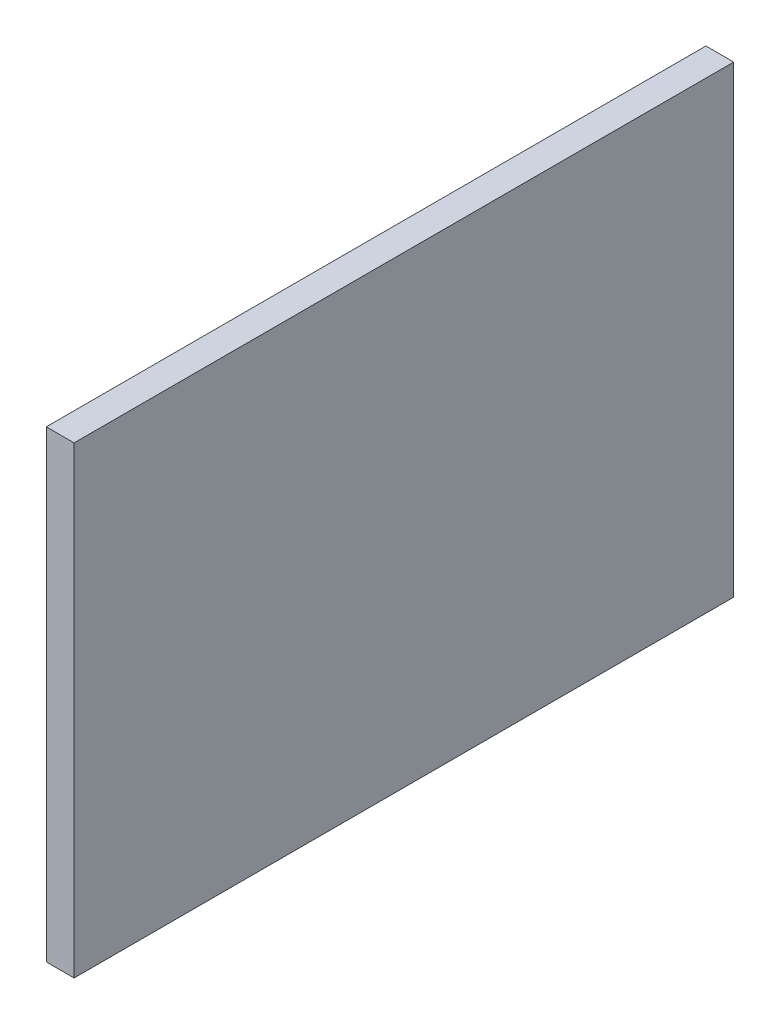
ISO-10303-21;
HEADER;
FILE_DESCRIPTION(('STEP AP214'),'2;1');
FILE_NAME('part.step','',(''),(''),'','','');
FILE_SCHEMA(('AUTOMOTIVE_DESIGN { 1 0 10303 214 1 1 1 1 }'));
ENDSEC;
DATA;
#1=APPLICATION_CONTEXT('core data for automotive mechanical design processes');
#2=APPLICATION_PROTOCOL_DEFINITION('international standard','automotive_design',2000,#1);
#3=PRODUCT_CONTEXT('',#1,'mechanical');
#4=PRODUCT('Part','Part','',(#3));
#5=PRODUCT_RELATED_PRODUCT_CATEGORY('part','',(#4));
#6=PRODUCT_DEFINITION_FORMATION('','',#4);
#7=PRODUCT_DEFINITION_CONTEXT('part definition',#1,'design');
#8=PRODUCT_DEFINITION('design','',#6,#7);
#9=PRODUCT_DEFINITION_SHAPE('','',#8);
#10=(LENGTH_UNIT() NAMED_UNIT(*) SI_UNIT(.MILLI.,.METRE.));
#11=(NAMED_UNIT(*) PLANE_ANGLE_UNIT() SI_UNIT($,.RADIAN.));
#12=(NAMED_UNIT(*) SI_UNIT($,.STERADIAN.) SOLID_ANGLE_UNIT());
#13=UNCERTAINTY_MEASURE_WITH_UNIT(LENGTH_MEASURE(1.E-05),#10,'distance_accuracy_value','');
#14=(GEOMETRIC_REPRESENTATION_CONTEXT(3) GLOBAL_UNCERTAINTY_ASSIGNED_CONTEXT((#13)) GLOBAL_UNIT_ASSIGNED_CONTEXT((#10,
#11,#12)) REPRESENTATION_CONTEXT('',''));
#15=CARTESIAN_POINT('',(0.,0.,0.));
#16=DIRECTION('',(0.,0.,1.));
#17=DIRECTION('',(1.,0.,0.));
#18=AXIS2_PLACEMENT_3D('',#15,#16,#17);
#19=CARTESIAN_POINT('',(18.,0.,0.));
#20=DIRECTION('',(0.,0.,-1.));
#21=DIRECTION('',(-1.,0.,0.));
#22=AXIS2_PLACEMENT_3D('',#19,#20,#21);
#23=PLANE('',#22);
#24=DIRECTION('',(0.,-1.,0.));
#25=VECTOR('',#24,1.);
#26=CARTESIAN_POINT('',(0.,0.,0.));
#27=LINE('',#26,#25);
#28=CARTESIAN_POINT('',(0.,300.,0.));
#29=VERTEX_POINT('',#28);
#30=CARTESIAN_POINT('',(0.,0.,0.));
#31=VERTEX_POINT('',#30);
#32=EDGE_CURVE('E96',#29,#31,#27,.T.);
#33=ORIENTED_EDGE('',*,*,#32,.T.);
#34=DIRECTION('',(-1.,0.,0.));
#35=VECTOR('',#34,1.);
#36=CARTESIAN_POINT('',(18.,0.,0.));
#37=LINE('',#36,#35);
#38=CARTESIAN_POINT('',(18.,0.,0.));
#39=VERTEX_POINT('',#38);
#40=EDGE_CURVE('E11',#39,#31,#37,.T.);
#41=ORIENTED_EDGE('',*,*,#40,.F.);
#42=DIRECTION('',(0.,-1.,0.));
#43=VECTOR('',#42,1.);
#44=CARTESIAN_POINT('',(18.,0.,0.));
#45=LINE('',#44,#43);
#46=CARTESIAN_POINT('',(18.,300.,0.));
#47=VERTEX_POINT('',#46);
#48=EDGE_CURVE('E84',#47,#39,#45,.T.);
#49=ORIENTED_EDGE('',*,*,#48,.F.);
#50=DIRECTION('',(-1.,0.,0.));
#51=VECTOR('',#50,1.);
#52=CARTESIAN_POINT('',(18.,300.,0.));
#53=LINE('',#52,#51);
#54=EDGE_CURVE('E92',#47,#29,#53,.T.);
#55=ORIENTED_EDGE('',*,*,#54,.T.);
#56=EDGE_LOOP('',(#33,#41,#49,#55));
#57=FACE_BOUND('',#56,.T.);
#58=ADVANCED_FACE('F33',(#57),#23,.F.);
#59=CARTESIAN_POINT('',(18.,0.,0.));
#60=DIRECTION('',(0.,1.,0.));
#61=DIRECTION('',(0.,0.,1.));
#62=AXIS2_PLACEMENT_3D('',#59,#60,#61);
#63=PLANE('',#62);
#64=DIRECTION('',(0.,0.,-1.));
#65=VECTOR('',#64,1.);
#66=CARTESIAN_POINT('',(0.,0.,0.));
#67=LINE('',#66,#65);
#68=CARTESIAN_POINT('',(0.,0.,-427.));
#69=VERTEX_POINT('',#68);
#70=EDGE_CURVE('E88',#31,#69,#67,.T.);
#71=ORIENTED_EDGE('',*,*,#70,.T.);
#72=DIRECTION('',(-1.,0.,0.));
#73=VECTOR('',#72,1.);
#74=CARTESIAN_POINT('',(18.,0.,-427.));
#75=LINE('',#74,#73);
#76=CARTESIAN_POINT('',(18.,0.,-427.));
#77=VERTEX_POINT('',#76);
#78=EDGE_CURVE('E41',#77,#69,#75,.T.);
#79=ORIENTED_EDGE('',*,*,#78,.F.);
#80=DIRECTION('',(0.,0.,-1.));
#81=VECTOR('',#80,1.);
#82=CARTESIAN_POINT('',(18.,0.,0.));
#83=LINE('',#82,#81);
#84=EDGE_CURVE('E79',#39,#77,#83,.T.);
#85=ORIENTED_EDGE('',*,*,#84,.F.);
#86=ORIENTED_EDGE('',*,*,#40,.T.);
#87=EDGE_LOOP('',(#71,#79,#85,#86));
#88=FACE_BOUND('',#87,.T.);
#89=ADVANCED_FACE('F87',(#88),#63,.F.);
#90=CARTESIAN_POINT('',(18.,0.,-427.));
#91=DIRECTION('',(0.,0.,1.));
#92=DIRECTION('',(1.,0.,0.));
#93=AXIS2_PLACEMENT_3D('',#90,#91,#92);
#94=PLANE('',#93);
#95=DIRECTION('',(0.,1.,0.));
#96=VECTOR('',#95,1.);
#97=CARTESIAN_POINT('',(0.,0.,-427.));
#98=LINE('',#97,#96);
#99=CARTESIAN_POINT('',(0.,300.,-427.));
#100=VERTEX_POINT('',#99);
#101=EDGE_CURVE('E66',#69,#100,#98,.T.);
#102=ORIENTED_EDGE('',*,*,#101,.T.);
#103=DIRECTION('',(-1.,0.,0.));
#104=VECTOR('',#103,1.);
#105=CARTESIAN_POINT('',(18.,300.,-427.));
#106=LINE('',#105,#104);
#107=CARTESIAN_POINT('',(18.,300.,-427.));
#108=VERTEX_POINT('',#107);
#109=EDGE_CURVE('E89',#108,#100,#106,.T.);
#110=ORIENTED_EDGE('',*,*,#109,.F.);
#111=DIRECTION('',(0.,1.,0.));
#112=VECTOR('',#111,1.);
#113=CARTESIAN_POINT('',(18.,0.,-427.));
#114=LINE('',#113,#112);
#115=EDGE_CURVE('E82',#77,#108,#114,.T.);
#116=ORIENTED_EDGE('',*,*,#115,.F.);
#117=ORIENTED_EDGE('',*,*,#78,.T.);
#118=EDGE_LOOP('',(#102,#110,#116,#117));
#119=FACE_BOUND('',#118,.T.);
#120=ADVANCED_FACE('F90',(#119),#94,.F.);
#121=CARTESIAN_POINT('',(18.,300.,0.));
#122=DIRECTION('',(0.,-1.,0.));
#123=DIRECTION('',(0.,0.,-1.));
#124=AXIS2_PLACEMENT_3D('',#121,#122,#123);
#125=PLANE('',#124);
#126=DIRECTION('',(0.,0.,1.));
#127=VECTOR('',#126,1.);
#128=CARTESIAN_POINT('',(0.,300.,0.));
#129=LINE('',#128,#127);
#130=EDGE_CURVE('E72',#100,#29,#129,.T.);
#131=ORIENTED_EDGE('',*,*,#130,.T.);
#132=ORIENTED_EDGE('',*,*,#54,.F.);
#133=DIRECTION('',(0.,0.,1.));
#134=VECTOR('',#133,1.);
#135=CARTESIAN_POINT('',(18.,300.,0.));
#136=LINE('',#135,#134);
#137=EDGE_CURVE('E49',#108,#47,#136,.T.);
#138=ORIENTED_EDGE('',*,*,#137,.F.);
#139=ORIENTED_EDGE('',*,*,#109,.T.);
#140=EDGE_LOOP('',(#131,#132,#138,#139));
#141=FACE_BOUND('',#140,.T.);
#142=ADVANCED_FACE('F103',(#141),#125,.F.);
#143=CARTESIAN_POINT('',(18.,0.,0.));
#144=DIRECTION('',(-1.,0.,0.));
#145=DIRECTION('',(0.,0.,1.));
#146=AXIS2_PLACEMENT_3D('',#143,#144,#145);
#147=PLANE('',#146);
#148=ORIENTED_EDGE('',*,*,#48,.T.);
#149=ORIENTED_EDGE('',*,*,#84,.T.);
#150=ORIENTED_EDGE('',*,*,#115,.T.);
#151=ORIENTED_EDGE('',*,*,#137,.T.);
#152=EDGE_LOOP('',(#148,#149,#150,#151));
#153=FACE_BOUND('',#152,.T.);
#154=ADVANCED_FACE('F80',(#153),#147,.F.);
#155=CARTESIAN_POINT('',(0.,0.,0.));
#156=DIRECTION('',(-1.,0.,0.));
#157=DIRECTION('',(0.,0.,1.));
#158=AXIS2_PLACEMENT_3D('',#155,#156,#157);
#159=PLANE('',#158);
#160=ORIENTED_EDGE('',*,*,#32,.F.);
#161=ORIENTED_EDGE('',*,*,#130,.F.);
#162=ORIENTED_EDGE('',*,*,#101,.F.);
#163=ORIENTED_EDGE('',*,*,#70,.F.);
#164=EDGE_LOOP('',(#160,#161,#162,#163));
#165=FACE_BOUND('',#164,.T.);
#166=ADVANCED_FACE('F106',(#165),#159,.T.);
#167=CLOSED_SHELL('',(#58,#89,#120,#142,#154,#166));
#168=MANIFOLD_SOLID_BREP('B2',#167);
#169=ADVANCED_BREP_SHAPE_REPRESENTATION('',(#18,#168),#14);
#170=SHAPE_DEFINITION_REPRESENTATION(#9,#169);
ENDSEC;
END-ISO-10303-21;
